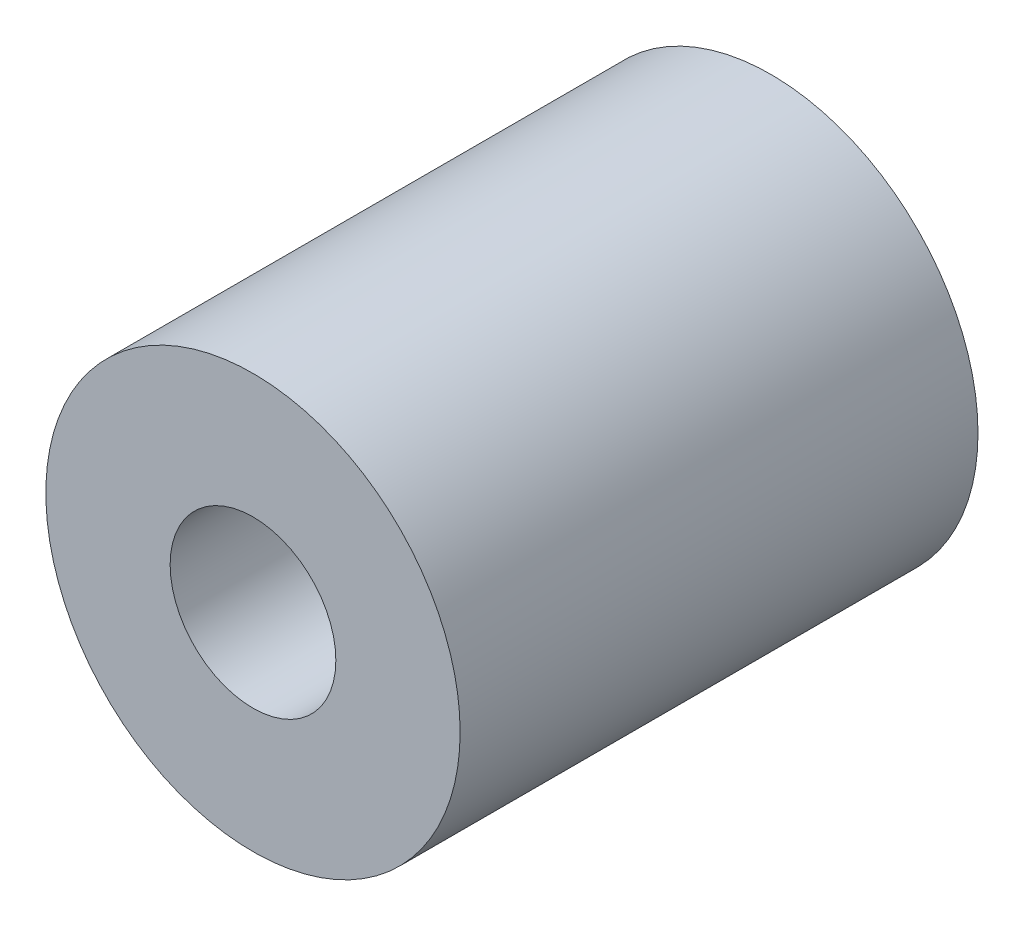
ISO-10303-21;
HEADER;
FILE_DESCRIPTION(('STEP AP214'),'2;1');
FILE_NAME('part.step','',(''),(''),'','','');
FILE_SCHEMA(('AUTOMOTIVE_DESIGN { 1 0 10303 214 1 1 1 1 }'));
ENDSEC;
DATA;
#1=APPLICATION_CONTEXT('core data for automotive mechanical design processes');
#2=APPLICATION_PROTOCOL_DEFINITION('international standard','automotive_design',2000,#1);
#3=PRODUCT_CONTEXT('',#1,'mechanical');
#4=PRODUCT('Part','Part','',(#3));
#5=PRODUCT_RELATED_PRODUCT_CATEGORY('part','',(#4));
#6=PRODUCT_DEFINITION_FORMATION('','',#4);
#7=PRODUCT_DEFINITION_CONTEXT('part definition',#1,'design');
#8=PRODUCT_DEFINITION('design','',#6,#7);
#9=PRODUCT_DEFINITION_SHAPE('','',#8);
#10=(LENGTH_UNIT() NAMED_UNIT(*) SI_UNIT(.MILLI.,.METRE.));
#11=(NAMED_UNIT(*) PLANE_ANGLE_UNIT() SI_UNIT($,.RADIAN.));
#12=(NAMED_UNIT(*) SI_UNIT($,.STERADIAN.) SOLID_ANGLE_UNIT());
#13=UNCERTAINTY_MEASURE_WITH_UNIT(LENGTH_MEASURE(1.E-05),#10,'distance_accuracy_value','');
#14=(GEOMETRIC_REPRESENTATION_CONTEXT(3) GLOBAL_UNCERTAINTY_ASSIGNED_CONTEXT((#13)) GLOBAL_UNIT_ASSIGNED_CONTEXT((#10,
#11,#12)) REPRESENTATION_CONTEXT('',''));
#15=CARTESIAN_POINT('',(0.,0.,0.));
#16=DIRECTION('',(0.,0.,1.));
#17=DIRECTION('',(1.,0.,0.));
#18=AXIS2_PLACEMENT_3D('',#15,#16,#17);
#19=CARTESIAN_POINT('',(0.,0.,20.));
#20=DIRECTION('',(0.,0.,1.));
#21=DIRECTION('',(1.,0.,0.));
#22=AXIS2_PLACEMENT_3D('',#19,#20,#21);
#23=PLANE('',#22);
#24=CARTESIAN_POINT('',(0.,0.,20.));
#25=DIRECTION('',(0.,0.,1.));
#26=DIRECTION('',(1.,0.,0.));
#27=AXIS2_PLACEMENT_3D('',#24,#25,#26);
#28=CIRCLE('',#27,3.);
#29=CARTESIAN_POINT('',(3.,0.,20.));
#30=VERTEX_POINT('',#29);
#31=EDGE_CURVE('E48',#30,#30,#28,.T.);
#32=ORIENTED_EDGE('',*,*,#31,.F.);
#33=EDGE_LOOP('',(#32));
#34=FACE_BOUND('',#33,.T.);
#35=CARTESIAN_POINT('',(0.,0.,20.));
#36=DIRECTION('',(0.,0.,1.));
#37=DIRECTION('',(1.,0.,0.));
#38=AXIS2_PLACEMENT_3D('',#35,#36,#37);
#39=CIRCLE('',#38,4.);
#40=CARTESIAN_POINT('',(4.,0.,20.));
#41=VERTEX_POINT('',#40);
#42=EDGE_CURVE('E62',#41,#41,#39,.T.);
#43=ORIENTED_EDGE('',*,*,#42,.T.);
#44=EDGE_LOOP('',(#43));
#45=FACE_BOUND('',#44,.T.);
#46=ADVANCED_FACE('F41',(#34,#45),#23,.T.);
#47=CARTESIAN_POINT('',(0.,0.,7.5));
#48=DIRECTION('',(0.,0.,1.));
#49=DIRECTION('',(1.,0.,0.));
#50=AXIS2_PLACEMENT_3D('',#47,#48,#49);
#51=PLANE('',#50);
#52=CARTESIAN_POINT('',(0.,0.,7.5));
#53=DIRECTION('',(0.,0.,1.));
#54=DIRECTION('',(1.,0.,0.));
#55=AXIS2_PLACEMENT_3D('',#52,#53,#54);
#56=CIRCLE('',#55,10.);
#57=CARTESIAN_POINT('',(10.,0.,7.5));
#58=VERTEX_POINT('',#57);
#59=EDGE_CURVE('E10',#58,#58,#56,.T.);
#60=ORIENTED_EDGE('',*,*,#59,.F.);
#61=EDGE_LOOP('',(#60));
#62=FACE_BOUND('',#61,.T.);
#63=CARTESIAN_POINT('',(0.,0.,7.5));
#64=DIRECTION('',(0.,0.,1.));
#65=DIRECTION('',(1.,0.,0.));
#66=AXIS2_PLACEMENT_3D('',#63,#64,#65);
#67=CIRCLE('',#66,3.);
#68=CARTESIAN_POINT('',(3.,0.,7.5));
#69=VERTEX_POINT('',#68);
#70=EDGE_CURVE('E52',#69,#69,#67,.T.);
#71=ORIENTED_EDGE('',*,*,#70,.T.);
#72=EDGE_LOOP('',(#71));
#73=FACE_BOUND('',#72,.T.);
#74=ADVANCED_FACE('F84',(#62,#73),#51,.F.);
#75=CARTESIAN_POINT('',(0.,0.,20.));
#76=DIRECTION('',(0.,0.,-1.));
#77=DIRECTION('',(-1.,0.,0.));
#78=AXIS2_PLACEMENT_3D('',#75,#76,#77);
#79=CYLINDRICAL_SURFACE('',#78,10.);
#80=ORIENTED_EDGE('',*,*,#59,.T.);
#81=EDGE_LOOP('',(#80));
#82=FACE_BOUND('',#81,.T.);
#83=CARTESIAN_POINT('',(0.,0.,32.5));
#84=DIRECTION('',(0.,0.,1.));
#85=DIRECTION('',(1.,0.,0.));
#86=AXIS2_PLACEMENT_3D('',#83,#84,#85);
#87=CIRCLE('',#86,10.);
#88=CARTESIAN_POINT('',(10.,0.,32.5));
#89=VERTEX_POINT('',#88);
#90=EDGE_CURVE('E57',#89,#89,#87,.T.);
#91=ORIENTED_EDGE('',*,*,#90,.F.);
#92=EDGE_LOOP('',(#91));
#93=FACE_BOUND('',#92,.T.);
#94=ADVANCED_FACE('F43',(#82,#93),#79,.T.);
#95=CARTESIAN_POINT('',(0.,0.,20.));
#96=DIRECTION('',(0.,0.,-1.));
#97=DIRECTION('',(-1.,0.,0.));
#98=AXIS2_PLACEMENT_3D('',#95,#96,#97);
#99=CYLINDRICAL_SURFACE('',#98,3.);
#100=ORIENTED_EDGE('',*,*,#31,.T.);
#101=EDGE_LOOP('',(#100));
#102=FACE_BOUND('',#101,.T.);
#103=ORIENTED_EDGE('',*,*,#70,.F.);
#104=EDGE_LOOP('',(#103));
#105=FACE_BOUND('',#104,.T.);
#106=ADVANCED_FACE('F73',(#102,#105),#99,.F.);
#107=CARTESIAN_POINT('',(0.,0.,32.5));
#108=DIRECTION('',(0.,0.,1.));
#109=DIRECTION('',(1.,0.,0.));
#110=AXIS2_PLACEMENT_3D('',#107,#108,#109);
#111=PLANE('',#110);
#112=ORIENTED_EDGE('',*,*,#90,.T.);
#113=EDGE_LOOP('',(#112));
#114=FACE_BOUND('',#113,.T.);
#115=CARTESIAN_POINT('',(0.,0.,32.5));
#116=DIRECTION('',(0.,0.,1.));
#117=DIRECTION('',(1.,0.,0.));
#118=AXIS2_PLACEMENT_3D('',#115,#116,#117);
#119=CIRCLE('',#118,4.);
#120=CARTESIAN_POINT('',(4.,0.,32.5));
#121=VERTEX_POINT('',#120);
#122=EDGE_CURVE('E61',#121,#121,#119,.T.);
#123=ORIENTED_EDGE('',*,*,#122,.F.);
#124=EDGE_LOOP('',(#123));
#125=FACE_BOUND('',#124,.T.);
#126=ADVANCED_FACE('F71',(#114,#125),#111,.T.);
#127=CARTESIAN_POINT('',(0.,0.,32.5));
#128=DIRECTION('',(0.,0.,-1.));
#129=DIRECTION('',(-1.,0.,0.));
#130=AXIS2_PLACEMENT_3D('',#127,#128,#129);
#131=CYLINDRICAL_SURFACE('',#130,4.);
#132=ORIENTED_EDGE('',*,*,#122,.T.);
#133=EDGE_LOOP('',(#132));
#134=FACE_BOUND('',#133,.T.);
#135=ORIENTED_EDGE('',*,*,#42,.F.);
#136=EDGE_LOOP('',(#135));
#137=FACE_BOUND('',#136,.T.);
#138=ADVANCED_FACE('F68',(#134,#137),#131,.F.);
#139=CLOSED_SHELL('',(#46,#74,#94,#106,#126,#138));
#140=MANIFOLD_SOLID_BREP('B2',#139);
#141=ADVANCED_BREP_SHAPE_REPRESENTATION('',(#18,#140),#14);
#142=SHAPE_DEFINITION_REPRESENTATION(#9,#141);
ENDSEC;
END-ISO-10303-21;
